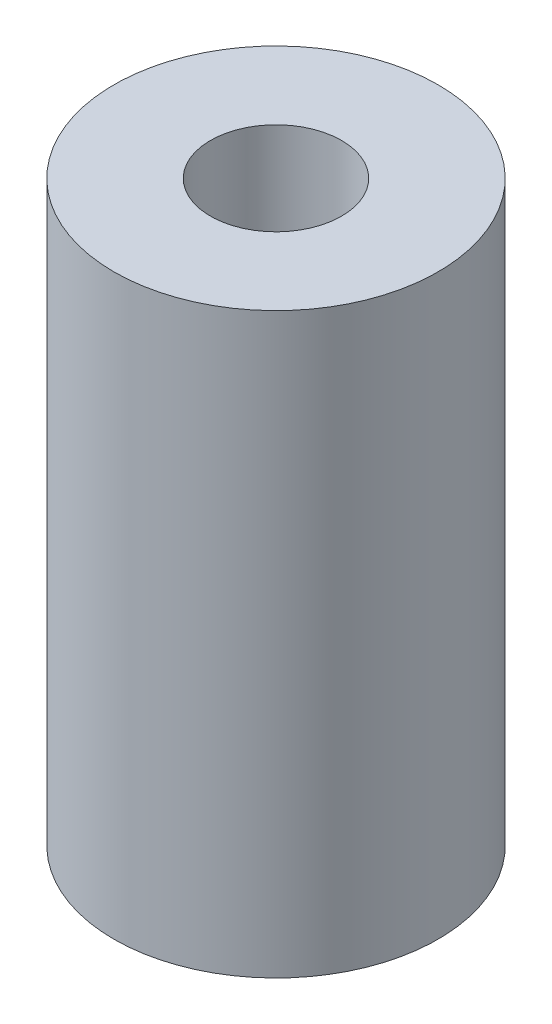
ISO-10303-21;
HEADER;
FILE_DESCRIPTION(('STEP AP214'),'2;1');
FILE_NAME('part.step','',(''),(''),'','','');
FILE_SCHEMA(('AUTOMOTIVE_DESIGN { 1 0 10303 214 1 1 1 1 }'));
ENDSEC;
DATA;
#1=APPLICATION_CONTEXT('core data for automotive mechanical design processes');
#2=APPLICATION_PROTOCOL_DEFINITION('international standard','automotive_design',2000,#1);
#3=PRODUCT_CONTEXT('',#1,'mechanical');
#4=PRODUCT('Part','Part','',(#3));
#5=PRODUCT_RELATED_PRODUCT_CATEGORY('part','',(#4));
#6=PRODUCT_DEFINITION_FORMATION('','',#4);
#7=PRODUCT_DEFINITION_CONTEXT('part definition',#1,'design');
#8=PRODUCT_DEFINITION('design','',#6,#7);
#9=PRODUCT_DEFINITION_SHAPE('','',#8);
#10=(LENGTH_UNIT() NAMED_UNIT(*) SI_UNIT(.MILLI.,.METRE.));
#11=(NAMED_UNIT(*) PLANE_ANGLE_UNIT() SI_UNIT($,.RADIAN.));
#12=(NAMED_UNIT(*) SI_UNIT($,.STERADIAN.) SOLID_ANGLE_UNIT());
#13=UNCERTAINTY_MEASURE_WITH_UNIT(LENGTH_MEASURE(1.E-05),#10,'distance_accuracy_value','');
#14=(GEOMETRIC_REPRESENTATION_CONTEXT(3) GLOBAL_UNCERTAINTY_ASSIGNED_CONTEXT((#13)) GLOBAL_UNIT_ASSIGNED_CONTEXT((#10,
#11,#12)) REPRESENTATION_CONTEXT('',''));
#15=CARTESIAN_POINT('',(0.,0.,0.));
#16=DIRECTION('',(0.,0.,1.));
#17=DIRECTION('',(1.,0.,0.));
#18=AXIS2_PLACEMENT_3D('',#15,#16,#17);
#19=CARTESIAN_POINT('',(0.,152.4,0.));
#20=DIRECTION('',(0.,1.,0.));
#21=DIRECTION('',(0.,0.,1.));
#22=AXIS2_PLACEMENT_3D('',#19,#20,#21);
#23=PLANE('',#22);
#24=CARTESIAN_POINT('',(0.,152.4,0.));
#25=DIRECTION('',(0.,1.,0.));
#26=DIRECTION('',(0.,0.,1.));
#27=AXIS2_PLACEMENT_3D('',#24,#25,#26);
#28=CIRCLE('',#27,42.7355);
#29=CARTESIAN_POINT('',(0.,152.4,-42.7355));
#30=VERTEX_POINT('',#29);
#31=EDGE_CURVE('E10',#30,#30,#28,.T.);
#32=ORIENTED_EDGE('',*,*,#31,.T.);
#33=EDGE_LOOP('',(#32));
#34=FACE_BOUND('',#33,.T.);
#35=CARTESIAN_POINT('',(0.,152.4,0.));
#36=DIRECTION('',(0.,1.,0.));
#37=DIRECTION('',(0.,0.,1.));
#38=AXIS2_PLACEMENT_3D('',#35,#36,#37);
#39=CIRCLE('',#38,17.2974);
#40=CARTESIAN_POINT('',(0.,152.4,-17.2974));
#41=VERTEX_POINT('',#40);
#42=EDGE_CURVE('E42',#41,#41,#39,.T.);
#43=ORIENTED_EDGE('',*,*,#42,.F.);
#44=EDGE_LOOP('',(#43));
#45=FACE_BOUND('',#44,.T.);
#46=ADVANCED_FACE('F31',(#34,#45),#23,.T.);
#47=CARTESIAN_POINT('',(0.,0.,0.));
#48=DIRECTION('',(0.,1.,0.));
#49=DIRECTION('',(0.,0.,1.));
#50=AXIS2_PLACEMENT_3D('',#47,#48,#49);
#51=PLANE('',#50);
#52=CARTESIAN_POINT('',(0.,0.,0.));
#53=DIRECTION('',(0.,1.,0.));
#54=DIRECTION('',(0.,0.,1.));
#55=AXIS2_PLACEMENT_3D('',#52,#53,#54);
#56=CIRCLE('',#55,42.7355);
#57=CARTESIAN_POINT('',(0.,0.,-42.7355));
#58=VERTEX_POINT('',#57);
#59=EDGE_CURVE('E35',#58,#58,#56,.T.);
#60=ORIENTED_EDGE('',*,*,#59,.F.);
#61=EDGE_LOOP('',(#60));
#62=FACE_BOUND('',#61,.T.);
#63=CARTESIAN_POINT('',(0.,0.,0.));
#64=DIRECTION('',(0.,1.,0.));
#65=DIRECTION('',(0.,0.,1.));
#66=AXIS2_PLACEMENT_3D('',#63,#64,#65);
#67=CIRCLE('',#66,17.2974);
#68=CARTESIAN_POINT('',(0.,0.,-17.2974));
#69=VERTEX_POINT('',#68);
#70=EDGE_CURVE('E44',#69,#69,#67,.T.);
#71=ORIENTED_EDGE('',*,*,#70,.T.);
#72=EDGE_LOOP('',(#71));
#73=FACE_BOUND('',#72,.T.);
#74=ADVANCED_FACE('F54',(#62,#73),#51,.F.);
#75=CARTESIAN_POINT('',(0.,152.4,0.));
#76=DIRECTION('',(0.,-1.,0.));
#77=DIRECTION('',(0.,0.,-1.));
#78=AXIS2_PLACEMENT_3D('',#75,#76,#77);
#79=CYLINDRICAL_SURFACE('',#78,42.7355);
#80=CARTESIAN_POINT('',(0.,152.4,-42.7355));
#81=CARTESIAN_POINT('',(0.,150.8125,-42.7355));
#82=CARTESIAN_POINT('',(0.,149.225,-42.7355));
#83=CARTESIAN_POINT('',(0.,146.05,-42.7355));
#84=CARTESIAN_POINT('',(0.,144.4625,-42.7355));
#85=CARTESIAN_POINT('',(0.,141.2875,-42.7355));
#86=CARTESIAN_POINT('',(0.,139.7,-42.7355));
#87=CARTESIAN_POINT('',(0.,136.525,-42.7355));
#88=CARTESIAN_POINT('',(0.,134.9375,-42.7355));
#89=CARTESIAN_POINT('',(0.,131.7625,-42.7355));
#90=CARTESIAN_POINT('',(0.,130.175,-42.7355));
#91=CARTESIAN_POINT('',(0.,127.,-42.7355));
#92=CARTESIAN_POINT('',(0.,125.4125,-42.7355));
#93=CARTESIAN_POINT('',(0.,122.2375,-42.7355));
#94=CARTESIAN_POINT('',(0.,120.65,-42.7355));
#95=CARTESIAN_POINT('',(0.,117.475,-42.7355));
#96=CARTESIAN_POINT('',(0.,115.8875,-42.7355));
#97=CARTESIAN_POINT('',(0.,112.7125,-42.7355));
#98=CARTESIAN_POINT('',(0.,111.125,-42.7355));
#99=CARTESIAN_POINT('',(0.,107.95,-42.7355));
#100=CARTESIAN_POINT('',(0.,106.3625,-42.7355));
#101=CARTESIAN_POINT('',(0.,103.1875,-42.7355));
#102=CARTESIAN_POINT('',(0.,101.6,-42.7355));
#103=CARTESIAN_POINT('',(0.,98.425,-42.7355));
#104=CARTESIAN_POINT('',(0.,96.8375,-42.7355));
#105=CARTESIAN_POINT('',(0.,93.6625,-42.7355));
#106=CARTESIAN_POINT('',(0.,92.075,-42.7355));
#107=CARTESIAN_POINT('',(0.,88.9,-42.7355));
#108=CARTESIAN_POINT('',(0.,87.3125,-42.7355));
#109=CARTESIAN_POINT('',(0.,84.1375,-42.7355));
#110=CARTESIAN_POINT('',(0.,82.55,-42.7355));
#111=CARTESIAN_POINT('',(0.,79.375,-42.7355));
#112=CARTESIAN_POINT('',(0.,77.7875,-42.7355));
#113=CARTESIAN_POINT('',(0.,74.6125,-42.7355));
#114=CARTESIAN_POINT('',(0.,73.025,-42.7355));
#115=CARTESIAN_POINT('',(0.,69.85,-42.7355));
#116=CARTESIAN_POINT('',(0.,68.2625,-42.7355));
#117=CARTESIAN_POINT('',(0.,65.0875,-42.7355));
#118=CARTESIAN_POINT('',(0.,63.5,-42.7355));
#119=CARTESIAN_POINT('',(0.,60.325,-42.7355));
#120=CARTESIAN_POINT('',(0.,58.7375,-42.7355));
#121=CARTESIAN_POINT('',(0.,55.5625,-42.7355));
#122=CARTESIAN_POINT('',(0.,53.975,-42.7355));
#123=CARTESIAN_POINT('',(0.,50.8,-42.7355));
#124=CARTESIAN_POINT('',(0.,49.2125,-42.7355));
#125=CARTESIAN_POINT('',(0.,46.0375,-42.7355));
#126=CARTESIAN_POINT('',(0.,44.45,-42.7355));
#127=CARTESIAN_POINT('',(0.,41.275,-42.7355));
#128=CARTESIAN_POINT('',(0.,39.6875,-42.7355));
#129=CARTESIAN_POINT('',(0.,36.5125,-42.7355));
#130=CARTESIAN_POINT('',(0.,34.925,-42.7355));
#131=CARTESIAN_POINT('',(0.,31.75,-42.7355));
#132=CARTESIAN_POINT('',(0.,30.1625,-42.7355));
#133=CARTESIAN_POINT('',(0.,26.9875,-42.7355));
#134=CARTESIAN_POINT('',(0.,25.4,-42.7355));
#135=CARTESIAN_POINT('',(0.,22.225,-42.7355));
#136=CARTESIAN_POINT('',(0.,20.6375,-42.7355));
#137=CARTESIAN_POINT('',(0.,17.4625,-42.7355));
#138=CARTESIAN_POINT('',(0.,15.875,-42.7355));
#139=CARTESIAN_POINT('',(0.,12.7,-42.7355));
#140=CARTESIAN_POINT('',(0.,11.1125,-42.7355));
#141=CARTESIAN_POINT('',(0.,7.93750000000001,-42.7355));
#142=CARTESIAN_POINT('',(0.,6.35,-42.7355));
#143=CARTESIAN_POINT('',(0.,3.175,-42.7355));
#144=CARTESIAN_POINT('',(0.,1.5875,-42.7355));
#145=CARTESIAN_POINT('',(0.,0.,-42.7355));
#146=B_SPLINE_CURVE_WITH_KNOTS('',3,(#80,#81,#82,#83,#84,#85,#86,#87,#88,#89,#90,#91,#92,#93,
#94,#95,#96,#97,#98,#99,#100,#101,#102,#103,#104,#105,#106,#107,#108,#109,#110,#111,#112,#113,
#114,#115,#116,#117,#118,#119,#120,#121,#122,#123,#124,#125,#126,#127,#128,#129,#130,#131,#132,
#133,#134,#135,#136,#137,#138,#139,#140,#141,#142,#143,#144,#145),.UNSPECIFIED.,.F.,.F.,(4,2,2,
2,2,2,2,2,2,2,2,2,2,2,2,2,2,2,2,2,2,2,2,2,2,2,2,2,2,2,2,2,4),(0.,4.76249999999998,
9.52499999999998,14.2875,19.05,23.8125,28.575,33.3375,38.1,42.8625,47.625,52.3875,57.15,61.9125,
66.675,71.4375,76.2,80.9625,85.725,90.4875,95.25,100.0125,104.775,109.5375,114.3,119.0625,
123.825,128.5875,133.35,138.1125,142.875,147.6375,152.4),.UNSPECIFIED.);
#147=EDGE_CURVE('BSEAM33',#30,#58,#146,.T.);
#148=ORIENTED_EDGE('',*,*,#31,.F.);
#149=ORIENTED_EDGE('',*,*,#59,.T.);
#150=ORIENTED_EDGE('',*,*,#147,.T.);
#151=ORIENTED_EDGE('',*,*,#147,.F.);
#152=EDGE_LOOP('',(#148,#150,#149,#151));
#153=FACE_BOUND('',#152,.T.);
#154=ADVANCED_FACE('F33',(#153),#79,.T.);
#155=CARTESIAN_POINT('',(0.,152.4,0.));
#156=DIRECTION('',(0.,-1.,0.));
#157=DIRECTION('',(0.,0.,-1.));
#158=AXIS2_PLACEMENT_3D('',#155,#156,#157);
#159=CYLINDRICAL_SURFACE('',#158,17.2974);
#160=CARTESIAN_POINT('',(0.,152.4,-17.2974));
#161=CARTESIAN_POINT('',(0.,150.8125,-17.2974));
#162=CARTESIAN_POINT('',(0.,149.225,-17.2974));
#163=CARTESIAN_POINT('',(0.,146.05,-17.2974));
#164=CARTESIAN_POINT('',(0.,144.4625,-17.2974));
#165=CARTESIAN_POINT('',(0.,141.2875,-17.2974));
#166=CARTESIAN_POINT('',(0.,139.7,-17.2974));
#167=CARTESIAN_POINT('',(0.,136.525,-17.2974));
#168=CARTESIAN_POINT('',(0.,134.9375,-17.2974));
#169=CARTESIAN_POINT('',(0.,131.7625,-17.2974));
#170=CARTESIAN_POINT('',(0.,130.175,-17.2974));
#171=CARTESIAN_POINT('',(0.,127.,-17.2974));
#172=CARTESIAN_POINT('',(0.,125.4125,-17.2974));
#173=CARTESIAN_POINT('',(0.,122.2375,-17.2974));
#174=CARTESIAN_POINT('',(0.,120.65,-17.2974));
#175=CARTESIAN_POINT('',(0.,117.475,-17.2974));
#176=CARTESIAN_POINT('',(0.,115.8875,-17.2974));
#177=CARTESIAN_POINT('',(0.,112.7125,-17.2974));
#178=CARTESIAN_POINT('',(0.,111.125,-17.2974));
#179=CARTESIAN_POINT('',(0.,107.95,-17.2974));
#180=CARTESIAN_POINT('',(0.,106.3625,-17.2974));
#181=CARTESIAN_POINT('',(0.,103.1875,-17.2974));
#182=CARTESIAN_POINT('',(0.,101.6,-17.2974));
#183=CARTESIAN_POINT('',(0.,98.425,-17.2974));
#184=CARTESIAN_POINT('',(0.,96.8375,-17.2974));
#185=CARTESIAN_POINT('',(0.,93.6625,-17.2974));
#186=CARTESIAN_POINT('',(0.,92.075,-17.2974));
#187=CARTESIAN_POINT('',(0.,88.9,-17.2974));
#188=CARTESIAN_POINT('',(0.,87.3125,-17.2974));
#189=CARTESIAN_POINT('',(0.,84.1375,-17.2974));
#190=CARTESIAN_POINT('',(0.,82.55,-17.2974));
#191=CARTESIAN_POINT('',(0.,79.375,-17.2974));
#192=CARTESIAN_POINT('',(0.,77.7875,-17.2974));
#193=CARTESIAN_POINT('',(0.,74.6125,-17.2974));
#194=CARTESIAN_POINT('',(0.,73.025,-17.2974));
#195=CARTESIAN_POINT('',(0.,69.85,-17.2974));
#196=CARTESIAN_POINT('',(0.,68.2625,-17.2974));
#197=CARTESIAN_POINT('',(0.,65.0875,-17.2974));
#198=CARTESIAN_POINT('',(0.,63.5,-17.2974));
#199=CARTESIAN_POINT('',(0.,60.325,-17.2974));
#200=CARTESIAN_POINT('',(0.,58.7375,-17.2974));
#201=CARTESIAN_POINT('',(0.,55.5625,-17.2974));
#202=CARTESIAN_POINT('',(0.,53.975,-17.2974));
#203=CARTESIAN_POINT('',(0.,50.8,-17.2974));
#204=CARTESIAN_POINT('',(0.,49.2125,-17.2974));
#205=CARTESIAN_POINT('',(0.,46.0375,-17.2974));
#206=CARTESIAN_POINT('',(0.,44.45,-17.2974));
#207=CARTESIAN_POINT('',(0.,41.275,-17.2974));
#208=CARTESIAN_POINT('',(0.,39.6875,-17.2974));
#209=CARTESIAN_POINT('',(0.,36.5125,-17.2974));
#210=CARTESIAN_POINT('',(0.,34.925,-17.2974));
#211=CARTESIAN_POINT('',(0.,31.75,-17.2974));
#212=CARTESIAN_POINT('',(0.,30.1625,-17.2974));
#213=CARTESIAN_POINT('',(0.,26.9875,-17.2974));
#214=CARTESIAN_POINT('',(0.,25.4,-17.2974));
#215=CARTESIAN_POINT('',(0.,22.225,-17.2974));
#216=CARTESIAN_POINT('',(0.,20.6375,-17.2974));
#217=CARTESIAN_POINT('',(0.,17.4625,-17.2974));
#218=CARTESIAN_POINT('',(0.,15.875,-17.2974));
#219=CARTESIAN_POINT('',(0.,12.7,-17.2974));
#220=CARTESIAN_POINT('',(0.,11.1125,-17.2974));
#221=CARTESIAN_POINT('',(0.,7.93750000000001,-17.2974));
#222=CARTESIAN_POINT('',(0.,6.35,-17.2974));
#223=CARTESIAN_POINT('',(0.,3.175,-17.2974));
#224=CARTESIAN_POINT('',(0.,1.5875,-17.2974));
#225=CARTESIAN_POINT('',(0.,0.,-17.2974));
#226=B_SPLINE_CURVE_WITH_KNOTS('',3,(#160,#161,#162,#163,#164,#165,#166,#167,#168,#169,#170,
#171,#172,#173,#174,#175,#176,#177,#178,#179,#180,#181,#182,#183,#184,#185,#186,#187,#188,#189,
#190,#191,#192,#193,#194,#195,#196,#197,#198,#199,#200,#201,#202,#203,#204,#205,#206,#207,#208,
#209,#210,#211,#212,#213,#214,#215,#216,#217,#218,#219,#220,#221,#222,#223,#224,#225),
.UNSPECIFIED.,.F.,.F.,(4,2,2,2,2,2,2,2,2,2,2,2,2,2,2,2,2,2,2,2,2,2,2,2,2,2,2,2,2,2,2,2,4),(0.,
4.76249999999998,9.52499999999998,14.2875,19.05,23.8125,28.575,33.3375,38.1,42.8625,47.625,
52.3875,57.15,61.9125,66.675,71.4375,76.2,80.9625,85.725,90.4875,95.25,100.0125,104.775,
109.5375,114.3,119.0625,123.825,128.5875,133.35,138.1125,142.875,147.6375,152.4),.UNSPECIFIED.);
#227=EDGE_CURVE('BSEAM50',#41,#69,#226,.T.);
#228=ORIENTED_EDGE('',*,*,#42,.T.);
#229=ORIENTED_EDGE('',*,*,#70,.F.);
#230=ORIENTED_EDGE('',*,*,#227,.T.);
#231=ORIENTED_EDGE('',*,*,#227,.F.);
#232=EDGE_LOOP('',(#228,#230,#229,#231));
#233=FACE_BOUND('',#232,.T.);
#234=ADVANCED_FACE('F50',(#233),#159,.F.);
#235=CLOSED_SHELL('',(#46,#74,#154,#234));
#236=MANIFOLD_SOLID_BREP('B2',#235);
#237=ADVANCED_BREP_SHAPE_REPRESENTATION('',(#18,#236),#14);
#238=SHAPE_DEFINITION_REPRESENTATION(#9,#237);
ENDSEC;
END-ISO-10303-21;
